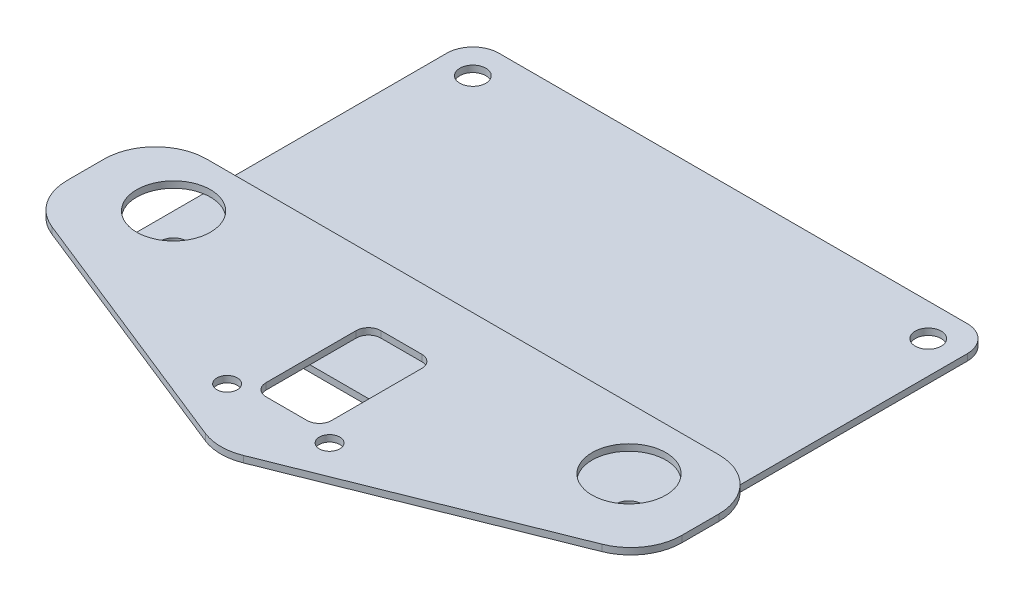
ISO-10303-21;
HEADER;
FILE_DESCRIPTION(('STEP AP214'),'2;1');
FILE_NAME('part.step','',(''),(''),'','','');
FILE_SCHEMA(('AUTOMOTIVE_DESIGN { 1 0 10303 214 1 1 1 1 }'));
ENDSEC;
DATA;
#1=APPLICATION_CONTEXT('core data for automotive mechanical design processes');
#2=APPLICATION_PROTOCOL_DEFINITION('international standard','automotive_design',2000,#1);
#3=PRODUCT_CONTEXT('',#1,'mechanical');
#4=PRODUCT('Part','Part','',(#3));
#5=PRODUCT_RELATED_PRODUCT_CATEGORY('part','',(#4));
#6=PRODUCT_DEFINITION_FORMATION('','',#4);
#7=PRODUCT_DEFINITION_CONTEXT('part definition',#1,'design');
#8=PRODUCT_DEFINITION('design','',#6,#7);
#9=PRODUCT_DEFINITION_SHAPE('','',#8);
#10=(LENGTH_UNIT() NAMED_UNIT(*) SI_UNIT(.MILLI.,.METRE.));
#11=(NAMED_UNIT(*) PLANE_ANGLE_UNIT() SI_UNIT($,.RADIAN.));
#12=(NAMED_UNIT(*) SI_UNIT($,.STERADIAN.) SOLID_ANGLE_UNIT());
#13=UNCERTAINTY_MEASURE_WITH_UNIT(LENGTH_MEASURE(1.E-05),#10,'distance_accuracy_value','');
#14=(GEOMETRIC_REPRESENTATION_CONTEXT(3) GLOBAL_UNCERTAINTY_ASSIGNED_CONTEXT((#13)) GLOBAL_UNIT_ASSIGNED_CONTEXT((#10,
#11,#12)) REPRESENTATION_CONTEXT('',''));
#15=CARTESIAN_POINT('',(0.,0.,0.));
#16=DIRECTION('',(0.,0.,1.));
#17=DIRECTION('',(1.,0.,0.));
#18=AXIS2_PLACEMENT_3D('',#15,#16,#17);
#19=CARTESIAN_POINT('',(0.,19.05,0.));
#20=DIRECTION('',(0.,-1.,0.));
#21=DIRECTION('',(0.,0.,-1.));
#22=AXIS2_PLACEMENT_3D('',#19,#20,#21);
#23=PLANE('',#22);
#24=DIRECTION('',(0.,0.,1.));
#25=VECTOR('',#24,1.);
#26=CARTESIAN_POINT('',(-16.,19.05,0.));
#27=LINE('',#26,#25);
#28=CARTESIAN_POINT('',(-16.,19.05,79.025));
#29=VERTEX_POINT('',#28);
#30=CARTESIAN_POINT('',(-16.,19.05,123.025));
#31=VERTEX_POINT('',#30);
#32=EDGE_CURVE('E415',#29,#31,#27,.T.);
#33=ORIENTED_EDGE('',*,*,#32,.F.);
#34=CARTESIAN_POINT('',(-10.,19.05,79.025));
#35=DIRECTION('',(0.,-1.,0.));
#36=DIRECTION('',(0.,0.,-1.));
#37=AXIS2_PLACEMENT_3D('',#34,#35,#36);
#38=CIRCLE('',#37,6.);
#39=CARTESIAN_POINT('',(-10.,19.05,73.025));
#40=VERTEX_POINT('',#39);
#41=EDGE_CURVE('E172',#29,#40,#38,.T.);
#42=ORIENTED_EDGE('',*,*,#41,.T.);
#43=DIRECTION('',(1.,0.,0.));
#44=VECTOR('',#43,1.);
#45=CARTESIAN_POINT('',(0.,19.05,73.025));
#46=LINE('',#45,#44);
#47=CARTESIAN_POINT('',(10.,19.05,73.025));
#48=VERTEX_POINT('',#47);
#49=EDGE_CURVE('E407',#40,#48,#46,.T.);
#50=ORIENTED_EDGE('',*,*,#49,.T.);
#51=CARTESIAN_POINT('',(10.,19.05,79.025));
#52=DIRECTION('',(0.,-1.,0.));
#53=DIRECTION('',(0.,0.,-1.));
#54=AXIS2_PLACEMENT_3D('',#51,#52,#53);
#55=CIRCLE('',#54,6.);
#56=CARTESIAN_POINT('',(16.,19.05,79.025));
#57=VERTEX_POINT('',#56);
#58=EDGE_CURVE('E13',#48,#57,#55,.T.);
#59=ORIENTED_EDGE('',*,*,#58,.T.);
#60=DIRECTION('',(0.,0.,1.));
#61=VECTOR('',#60,1.);
#62=CARTESIAN_POINT('',(16.,19.05,0.));
#63=LINE('',#62,#61);
#64=CARTESIAN_POINT('',(16.,19.05,123.025));
#65=VERTEX_POINT('',#64);
#66=EDGE_CURVE('E405',#57,#65,#63,.T.);
#67=ORIENTED_EDGE('',*,*,#66,.T.);
#68=CARTESIAN_POINT('',(10.,19.05,123.025));
#69=DIRECTION('',(0.,-1.,0.));
#70=DIRECTION('',(0.,0.,-1.));
#71=AXIS2_PLACEMENT_3D('',#68,#69,#70);
#72=CIRCLE('',#71,6.);
#73=CARTESIAN_POINT('',(10.,19.05,129.025));
#74=VERTEX_POINT('',#73);
#75=EDGE_CURVE('E378',#65,#74,#72,.T.);
#76=ORIENTED_EDGE('',*,*,#75,.T.);
#77=DIRECTION('',(1.,0.,0.));
#78=VECTOR('',#77,1.);
#79=CARTESIAN_POINT('',(0.,19.05,129.025));
#80=LINE('',#79,#78);
#81=CARTESIAN_POINT('',(-10.,19.05,129.025));
#82=VERTEX_POINT('',#81);
#83=EDGE_CURVE('E426',#82,#74,#80,.T.);
#84=ORIENTED_EDGE('',*,*,#83,.F.);
#85=CARTESIAN_POINT('',(-10.,19.05,123.025));
#86=DIRECTION('',(0.,-1.,0.));
#87=DIRECTION('',(0.,0.,-1.));
#88=AXIS2_PLACEMENT_3D('',#85,#86,#87);
#89=CIRCLE('',#88,6.);
#90=EDGE_CURVE('E384',#82,#31,#89,.T.);
#91=ORIENTED_EDGE('',*,*,#90,.T.);
#92=EDGE_LOOP('',(#33,#42,#50,#59,#67,#76,#84,#91));
#93=FACE_BOUND('',#92,.T.);
#94=DIRECTION('',(1.,0.,0.));
#95=VECTOR('',#94,1.);
#96=CARTESIAN_POINT('',(-150.,19.05,43.025));
#97=LINE('',#96,#95);
#98=CARTESIAN_POINT('',(-125.,19.05,43.025));
#99=VERTEX_POINT('',#98);
#100=CARTESIAN_POINT('',(125.,19.05,43.0249999999999));
#101=VERTEX_POINT('',#100);
#102=EDGE_CURVE('E443',#99,#101,#97,.T.);
#103=ORIENTED_EDGE('',*,*,#102,.F.);
#104=CARTESIAN_POINT('',(-125.,19.05,68.025));
#105=DIRECTION('',(0.,-1.,0.));
#106=DIRECTION('',(0.,0.,-1.));
#107=AXIS2_PLACEMENT_3D('',#104,#105,#106);
#108=CIRCLE('',#107,25.);
#109=CARTESIAN_POINT('',(-150.,19.05,68.025));
#110=VERTEX_POINT('',#109);
#111=EDGE_CURVE('E337',#99,#110,#108,.F.);
#112=ORIENTED_EDGE('',*,*,#111,.T.);
#113=DIRECTION('',(0.,0.,-1.));
#114=VECTOR('',#113,1.);
#115=CARTESIAN_POINT('',(-150.,19.05,103.025));
#116=LINE('',#115,#114);
#117=CARTESIAN_POINT('',(-150.,19.05,86.0991759643275));
#118=VERTEX_POINT('',#117);
#119=EDGE_CURVE('E441',#118,#110,#116,.T.);
#120=ORIENTED_EDGE('',*,*,#119,.F.);
#121=CARTESIAN_POINT('',(-125.,19.05,86.0991759643275));
#122=DIRECTION('',(0.,-1.,0.));
#123=DIRECTION('',(0.,0.,-1.));
#124=AXIS2_PLACEMENT_3D('',#121,#122,#123);
#125=CIRCLE('',#124,25.);
#126=CARTESIAN_POINT('',(-134.284766908853,19.05,109.311093236459));
#127=VERTEX_POINT('',#126);
#128=EDGE_CURVE('E309',#118,#127,#125,.F.);
#129=ORIENTED_EDGE('',*,*,#128,.T.);
#130=DIRECTION('',(-0.928476690885259,0.,-0.371390676354104));
#131=VECTOR('',#130,1.);
#132=CARTESIAN_POINT('',(0.,19.05,163.025));
#133=LINE('',#132,#131);
#134=CARTESIAN_POINT('',(-9.28476690885259,19.05,159.311093236459));
#135=VERTEX_POINT('',#134);
#136=EDGE_CURVE('E310',#135,#127,#133,.T.);
#137=ORIENTED_EDGE('',*,*,#136,.F.);
#138=CARTESIAN_POINT('',(0.,19.05,136.099175964327));
#139=DIRECTION('',(0.,-1.,0.));
#140=DIRECTION('',(0.,0.,-1.));
#141=AXIS2_PLACEMENT_3D('',#138,#139,#140);
#142=CIRCLE('',#141,25.);
#143=CARTESIAN_POINT('',(9.2847669088526,19.05,159.311093236459));
#144=VERTEX_POINT('',#143);
#145=EDGE_CURVE('E330',#135,#144,#142,.F.);
#146=ORIENTED_EDGE('',*,*,#145,.T.);
#147=DIRECTION('',(-0.928476690885259,0.,0.371390676354104));
#148=VECTOR('',#147,1.);
#149=CARTESIAN_POINT('',(150.,19.05,103.025));
#150=LINE('',#149,#148);
#151=CARTESIAN_POINT('',(134.284766908853,19.05,109.311093236459));
#152=VERTEX_POINT('',#151);
#153=EDGE_CURVE('E315',#152,#144,#150,.T.);
#154=ORIENTED_EDGE('',*,*,#153,.F.);
#155=CARTESIAN_POINT('',(125.,19.05,86.0991759643275));
#156=DIRECTION('',(0.,-1.,0.));
#157=DIRECTION('',(0.,0.,-1.));
#158=AXIS2_PLACEMENT_3D('',#155,#156,#157);
#159=CIRCLE('',#158,25.);
#160=CARTESIAN_POINT('',(150.,19.05,86.0991759643275));
#161=VERTEX_POINT('',#160);
#162=EDGE_CURVE('E332',#152,#161,#159,.F.);
#163=ORIENTED_EDGE('',*,*,#162,.T.);
#164=DIRECTION('',(0.,0.,1.));
#165=VECTOR('',#164,1.);
#166=CARTESIAN_POINT('',(150.,19.05,43.0249999999999));
#167=LINE('',#166,#165);
#168=CARTESIAN_POINT('',(150.,19.05,68.0249999999999));
#169=VERTEX_POINT('',#168);
#170=EDGE_CURVE('E446',#169,#161,#167,.T.);
#171=ORIENTED_EDGE('',*,*,#170,.F.);
#172=CARTESIAN_POINT('',(125.,19.05,68.0249999999999));
#173=DIRECTION('',(0.,-1.,0.));
#174=DIRECTION('',(0.,0.,-1.));
#175=AXIS2_PLACEMENT_3D('',#172,#173,#174);
#176=CIRCLE('',#175,25.);
#177=EDGE_CURVE('E334',#169,#101,#176,.F.);
#178=ORIENTED_EDGE('',*,*,#177,.T.);
#179=EDGE_LOOP('',(#103,#112,#120,#129,#137,#146,#154,#163,#171,#178));
#180=FACE_BOUND('',#179,.T.);
#181=CARTESIAN_POINT('',(111.125,19.05,73.025));
#182=DIRECTION('',(0.,1.,0.));
#183=DIRECTION('',(0.,0.,1.));
#184=AXIS2_PLACEMENT_3D('',#181,#182,#183);
#185=CIRCLE('',#184,18.);
#186=CARTESIAN_POINT('',(111.125,19.05,91.025));
#187=VERTEX_POINT('',#186);
#188=EDGE_CURVE('E305',#187,#187,#185,.T.);
#189=ORIENTED_EDGE('',*,*,#188,.F.);
#190=EDGE_LOOP('',(#189));
#191=FACE_BOUND('',#190,.T.);
#192=CARTESIAN_POINT('',(-111.125,19.05,73.025));
#193=DIRECTION('',(0.,1.,0.));
#194=DIRECTION('',(0.,0.,1.));
#195=AXIS2_PLACEMENT_3D('',#192,#193,#194);
#196=CIRCLE('',#195,18.);
#197=CARTESIAN_POINT('',(-111.125,19.05,91.025));
#198=VERTEX_POINT('',#197);
#199=EDGE_CURVE('E432',#198,#198,#196,.T.);
#200=ORIENTED_EDGE('',*,*,#199,.F.);
#201=EDGE_LOOP('',(#200));
#202=FACE_BOUND('',#201,.T.);
#203=CARTESIAN_POINT('',(-25.,19.05,133.025));
#204=DIRECTION('',(0.,1.,0.));
#205=DIRECTION('',(0.,0.,1.));
#206=AXIS2_PLACEMENT_3D('',#203,#204,#205);
#207=CIRCLE('',#206,5.);
#208=CARTESIAN_POINT('',(-25.,19.05,138.025));
#209=VERTEX_POINT('',#208);
#210=EDGE_CURVE('E716',#209,#209,#207,.T.);
#211=ORIENTED_EDGE('',*,*,#210,.F.);
#212=EDGE_LOOP('',(#211));
#213=FACE_BOUND('',#212,.T.);
#214=CARTESIAN_POINT('',(25.,19.05,133.025));
#215=DIRECTION('',(0.,1.,0.));
#216=DIRECTION('',(0.,0.,1.));
#217=AXIS2_PLACEMENT_3D('',#214,#215,#216);
#218=CIRCLE('',#217,5.);
#219=CARTESIAN_POINT('',(25.,19.05,138.025));
#220=VERTEX_POINT('',#219);
#221=EDGE_CURVE('E719',#220,#220,#218,.T.);
#222=ORIENTED_EDGE('',*,*,#221,.F.);
#223=EDGE_LOOP('',(#222));
#224=FACE_BOUND('',#223,.T.);
#225=ADVANCED_FACE('F150',(#93,#180,#191,#202,#213,#224),#23,.F.);
#226=CARTESIAN_POINT('',(0.,15.875,0.));
#227=DIRECTION('',(0.,-1.,0.));
#228=DIRECTION('',(0.,0.,-1.));
#229=AXIS2_PLACEMENT_3D('',#226,#227,#228);
#230=PLANE('',#229);
#231=CARTESIAN_POINT('',(-25.,15.875,133.025));
#232=DIRECTION('',(0.,1.,0.));
#233=DIRECTION('',(0.,0.,1.));
#234=AXIS2_PLACEMENT_3D('',#231,#232,#233);
#235=CIRCLE('',#234,5.);
#236=CARTESIAN_POINT('',(-25.,15.875,138.025));
#237=VERTEX_POINT('',#236);
#238=EDGE_CURVE('E720',#237,#237,#235,.T.);
#239=ORIENTED_EDGE('',*,*,#238,.T.);
#240=EDGE_LOOP('',(#239));
#241=FACE_BOUND('',#240,.T.);
#242=CARTESIAN_POINT('',(111.125,15.875,73.025));
#243=DIRECTION('',(0.,1.,0.));
#244=DIRECTION('',(0.,0.,1.));
#245=AXIS2_PLACEMENT_3D('',#242,#243,#244);
#246=CIRCLE('',#245,18.);
#247=CARTESIAN_POINT('',(111.125,15.875,91.025));
#248=VERTEX_POINT('',#247);
#249=EDGE_CURVE('E430',#248,#248,#246,.T.);
#250=ORIENTED_EDGE('',*,*,#249,.T.);
#251=EDGE_LOOP('',(#250));
#252=FACE_BOUND('',#251,.T.);
#253=DIRECTION('',(0.,0.,-1.));
#254=VECTOR('',#253,1.);
#255=CARTESIAN_POINT('',(-150.,15.875,103.025));
#256=LINE('',#255,#254);
#257=CARTESIAN_POINT('',(-150.,15.875,86.0991759643275));
#258=VERTEX_POINT('',#257);
#259=CARTESIAN_POINT('',(-150.,15.875,68.025));
#260=VERTEX_POINT('',#259);
#261=EDGE_CURVE('E286',#258,#260,#256,.T.);
#262=ORIENTED_EDGE('',*,*,#261,.T.);
#263=CARTESIAN_POINT('',(-125.,15.875,68.025));
#264=DIRECTION('',(0.,-1.,0.));
#265=DIRECTION('',(0.,0.,-1.));
#266=AXIS2_PLACEMENT_3D('',#263,#264,#265);
#267=CIRCLE('',#266,25.);
#268=CARTESIAN_POINT('',(-125.,15.875,43.025));
#269=VERTEX_POINT('',#268);
#270=EDGE_CURVE('E293',#260,#269,#267,.T.);
#271=ORIENTED_EDGE('',*,*,#270,.T.);
#272=DIRECTION('',(1.,0.,0.));
#273=VECTOR('',#272,1.);
#274=CARTESIAN_POINT('',(-150.,15.875,43.025));
#275=LINE('',#274,#273);
#276=CARTESIAN_POINT('',(125.,15.875,43.0249999999999));
#277=VERTEX_POINT('',#276);
#278=EDGE_CURVE('E304',#269,#277,#275,.T.);
#279=ORIENTED_EDGE('',*,*,#278,.T.);
#280=CARTESIAN_POINT('',(125.,15.875,68.0249999999999));
#281=DIRECTION('',(0.,-1.,0.));
#282=DIRECTION('',(0.,0.,-1.));
#283=AXIS2_PLACEMENT_3D('',#280,#281,#282);
#284=CIRCLE('',#283,25.);
#285=CARTESIAN_POINT('',(150.,15.875,68.0249999999999));
#286=VERTEX_POINT('',#285);
#287=EDGE_CURVE('E294',#277,#286,#284,.T.);
#288=ORIENTED_EDGE('',*,*,#287,.T.);
#289=DIRECTION('',(0.,0.,1.));
#290=VECTOR('',#289,1.);
#291=CARTESIAN_POINT('',(150.,15.875,43.0249999999999));
#292=LINE('',#291,#290);
#293=CARTESIAN_POINT('',(150.,15.875,86.0991759643275));
#294=VERTEX_POINT('',#293);
#295=EDGE_CURVE('E453',#286,#294,#292,.T.);
#296=ORIENTED_EDGE('',*,*,#295,.T.);
#297=CARTESIAN_POINT('',(125.,15.875,86.0991759643275));
#298=DIRECTION('',(0.,-1.,0.));
#299=DIRECTION('',(0.,0.,-1.));
#300=AXIS2_PLACEMENT_3D('',#297,#298,#299);
#301=CIRCLE('',#300,25.);
#302=CARTESIAN_POINT('',(134.284766908853,15.875,109.311093236459));
#303=VERTEX_POINT('',#302);
#304=EDGE_CURVE('E321',#294,#303,#301,.T.);
#305=ORIENTED_EDGE('',*,*,#304,.T.);
#306=DIRECTION('',(-0.928476690885259,0.,0.371390676354104));
#307=VECTOR('',#306,1.);
#308=CARTESIAN_POINT('',(150.,15.875,103.025));
#309=LINE('',#308,#307);
#310=CARTESIAN_POINT('',(9.2847669088526,15.875,159.311093236459));
#311=VERTEX_POINT('',#310);
#312=EDGE_CURVE('E455',#303,#311,#309,.T.);
#313=ORIENTED_EDGE('',*,*,#312,.T.);
#314=CARTESIAN_POINT('',(0.,15.875,136.099175964327));
#315=DIRECTION('',(0.,-1.,0.));
#316=DIRECTION('',(0.,0.,-1.));
#317=AXIS2_PLACEMENT_3D('',#314,#315,#316);
#318=CIRCLE('',#317,25.);
#319=CARTESIAN_POINT('',(-9.28476690885259,15.875,159.311093236459));
#320=VERTEX_POINT('',#319);
#321=EDGE_CURVE('E312',#311,#320,#318,.T.);
#322=ORIENTED_EDGE('',*,*,#321,.T.);
#323=DIRECTION('',(-0.928476690885259,0.,-0.371390676354104));
#324=VECTOR('',#323,1.);
#325=CARTESIAN_POINT('',(0.,15.875,163.025));
#326=LINE('',#325,#324);
#327=CARTESIAN_POINT('',(-134.284766908853,15.875,109.311093236459));
#328=VERTEX_POINT('',#327);
#329=EDGE_CURVE('E288',#320,#328,#326,.T.);
#330=ORIENTED_EDGE('',*,*,#329,.T.);
#331=CARTESIAN_POINT('',(-125.,15.875,86.0991759643275));
#332=DIRECTION('',(0.,-1.,0.));
#333=DIRECTION('',(0.,0.,-1.));
#334=AXIS2_PLACEMENT_3D('',#331,#332,#333);
#335=CIRCLE('',#334,25.);
#336=EDGE_CURVE('E282',#328,#258,#335,.T.);
#337=ORIENTED_EDGE('',*,*,#336,.T.);
#338=EDGE_LOOP('',(#262,#271,#279,#288,#296,#305,#313,#322,#330,#337));
#339=FACE_BOUND('',#338,.T.);
#340=DIRECTION('',(0.,0.,1.));
#341=VECTOR('',#340,1.);
#342=CARTESIAN_POINT('',(16.,15.875,0.));
#343=LINE('',#342,#341);
#344=CARTESIAN_POINT('',(16.,15.875,79.025));
#345=VERTEX_POINT('',#344);
#346=CARTESIAN_POINT('',(16.,15.875,123.025));
#347=VERTEX_POINT('',#346);
#348=EDGE_CURVE('E394',#345,#347,#343,.T.);
#349=ORIENTED_EDGE('',*,*,#348,.F.);
#350=CARTESIAN_POINT('',(10.,15.875,79.025));
#351=DIRECTION('',(0.,-1.,0.));
#352=DIRECTION('',(0.,0.,-1.));
#353=AXIS2_PLACEMENT_3D('',#350,#351,#352);
#354=CIRCLE('',#353,6.);
#355=CARTESIAN_POINT('',(10.,15.875,73.025));
#356=VERTEX_POINT('',#355);
#357=EDGE_CURVE('E158',#345,#356,#354,.F.);
#358=ORIENTED_EDGE('',*,*,#357,.T.);
#359=DIRECTION('',(1.,0.,0.));
#360=VECTOR('',#359,1.);
#361=CARTESIAN_POINT('',(0.,15.875,73.025));
#362=LINE('',#361,#360);
#363=CARTESIAN_POINT('',(-10.,15.875,73.025));
#364=VERTEX_POINT('',#363);
#365=EDGE_CURVE('E392',#364,#356,#362,.T.);
#366=ORIENTED_EDGE('',*,*,#365,.F.);
#367=CARTESIAN_POINT('',(-10.,15.875,79.025));
#368=DIRECTION('',(0.,-1.,0.));
#369=DIRECTION('',(0.,0.,-1.));
#370=AXIS2_PLACEMENT_3D('',#367,#368,#369);
#371=CIRCLE('',#370,6.);
#372=CARTESIAN_POINT('',(-16.,15.875,79.025));
#373=VERTEX_POINT('',#372);
#374=EDGE_CURVE('E387',#364,#373,#371,.F.);
#375=ORIENTED_EDGE('',*,*,#374,.T.);
#376=DIRECTION('',(0.,0.,1.));
#377=VECTOR('',#376,1.);
#378=CARTESIAN_POINT('',(-16.,15.875,0.));
#379=LINE('',#378,#377);
#380=CARTESIAN_POINT('',(-16.,15.875,123.025));
#381=VERTEX_POINT('',#380);
#382=EDGE_CURVE('E399',#373,#381,#379,.T.);
#383=ORIENTED_EDGE('',*,*,#382,.T.);
#384=CARTESIAN_POINT('',(-10.,15.875,123.025));
#385=DIRECTION('',(0.,-1.,0.));
#386=DIRECTION('',(0.,0.,-1.));
#387=AXIS2_PLACEMENT_3D('',#384,#385,#386);
#388=CIRCLE('',#387,6.);
#389=CARTESIAN_POINT('',(-10.,15.875,129.025));
#390=VERTEX_POINT('',#389);
#391=EDGE_CURVE('E381',#381,#390,#388,.F.);
#392=ORIENTED_EDGE('',*,*,#391,.T.);
#393=DIRECTION('',(1.,0.,0.));
#394=VECTOR('',#393,1.);
#395=CARTESIAN_POINT('',(0.,15.875,129.025));
#396=LINE('',#395,#394);
#397=CARTESIAN_POINT('',(10.,15.875,129.025));
#398=VERTEX_POINT('',#397);
#399=EDGE_CURVE('E412',#390,#398,#396,.T.);
#400=ORIENTED_EDGE('',*,*,#399,.T.);
#401=CARTESIAN_POINT('',(10.,15.875,123.025));
#402=DIRECTION('',(0.,-1.,0.));
#403=DIRECTION('',(0.,0.,-1.));
#404=AXIS2_PLACEMENT_3D('',#401,#402,#403);
#405=CIRCLE('',#404,6.);
#406=EDGE_CURVE('E375',#398,#347,#405,.F.);
#407=ORIENTED_EDGE('',*,*,#406,.T.);
#408=EDGE_LOOP('',(#349,#358,#366,#375,#383,#392,#400,#407));
#409=FACE_BOUND('',#408,.T.);
#410=CARTESIAN_POINT('',(-111.125,15.875,73.025));
#411=DIRECTION('',(0.,1.,0.));
#412=DIRECTION('',(0.,0.,1.));
#413=AXIS2_PLACEMENT_3D('',#410,#411,#412);
#414=CIRCLE('',#413,18.);
#415=CARTESIAN_POINT('',(-111.125,15.875,91.025));
#416=VERTEX_POINT('',#415);
#417=EDGE_CURVE('E420',#416,#416,#414,.T.);
#418=ORIENTED_EDGE('',*,*,#417,.T.);
#419=EDGE_LOOP('',(#418));
#420=FACE_BOUND('',#419,.T.);
#421=CARTESIAN_POINT('',(25.,15.875,133.025));
#422=DIRECTION('',(0.,1.,0.));
#423=DIRECTION('',(0.,0.,1.));
#424=AXIS2_PLACEMENT_3D('',#421,#422,#423);
#425=CIRCLE('',#424,5.);
#426=CARTESIAN_POINT('',(25.,15.875,138.025));
#427=VERTEX_POINT('',#426);
#428=EDGE_CURVE('E721',#427,#427,#425,.T.);
#429=ORIENTED_EDGE('',*,*,#428,.T.);
#430=EDGE_LOOP('',(#429));
#431=FACE_BOUND('',#430,.T.);
#432=ADVANCED_FACE('F284',(#241,#252,#339,#409,#420,#431),#230,.T.);
#433=CARTESIAN_POINT('',(-150.,19.05,103.025));
#434=DIRECTION('',(-1.,0.,0.));
#435=DIRECTION('',(0.,0.,1.));
#436=AXIS2_PLACEMENT_3D('',#433,#434,#435);
#437=PLANE('',#436);
#438=ORIENTED_EDGE('',*,*,#119,.T.);
#439=DIRECTION('',(0.,-1.,0.));
#440=VECTOR('',#439,1.);
#441=CARTESIAN_POINT('',(-150.,19.05,68.025));
#442=LINE('',#441,#440);
#443=EDGE_CURVE('E303',#110,#260,#442,.T.);
#444=ORIENTED_EDGE('',*,*,#443,.T.);
#445=ORIENTED_EDGE('',*,*,#261,.F.);
#446=DIRECTION('',(0.,-1.,0.));
#447=VECTOR('',#446,1.);
#448=CARTESIAN_POINT('',(-150.,19.05,86.0991759643275));
#449=LINE('',#448,#447);
#450=EDGE_CURVE('E300',#258,#118,#449,.F.);
#451=ORIENTED_EDGE('',*,*,#450,.T.);
#452=EDGE_LOOP('',(#438,#444,#445,#451));
#453=FACE_BOUND('',#452,.T.);
#454=ADVANCED_FACE('F299',(#453),#437,.T.);
#455=CARTESIAN_POINT('',(0.,19.05,163.025));
#456=DIRECTION('',(-0.371390676354104,0.,0.928476690885259));
#457=DIRECTION('',(0.928476690885259,0.,0.371390676354104));
#458=AXIS2_PLACEMENT_3D('',#455,#456,#457);
#459=PLANE('',#458);
#460=ORIENTED_EDGE('',*,*,#136,.T.);
#461=DIRECTION('',(0.,-1.,0.));
#462=VECTOR('',#461,1.);
#463=CARTESIAN_POINT('',(-134.284766908853,19.05,109.311093236459));
#464=LINE('',#463,#462);
#465=EDGE_CURVE('E341',#127,#328,#464,.T.);
#466=ORIENTED_EDGE('',*,*,#465,.T.);
#467=ORIENTED_EDGE('',*,*,#329,.F.);
#468=DIRECTION('',(0.,-1.,0.));
#469=VECTOR('',#468,1.);
#470=CARTESIAN_POINT('',(-9.28476690885259,19.05,159.311093236459));
#471=LINE('',#470,#469);
#472=EDGE_CURVE('E339',#320,#135,#471,.F.);
#473=ORIENTED_EDGE('',*,*,#472,.T.);
#474=EDGE_LOOP('',(#460,#466,#467,#473));
#475=FACE_BOUND('',#474,.T.);
#476=ADVANCED_FACE('F488',(#475),#459,.T.);
#477=CARTESIAN_POINT('',(150.,19.05,103.025));
#478=DIRECTION('',(0.371390676354104,0.,0.928476690885259));
#479=DIRECTION('',(0.928476690885259,0.,-0.371390676354104));
#480=AXIS2_PLACEMENT_3D('',#477,#478,#479);
#481=PLANE('',#480);
#482=ORIENTED_EDGE('',*,*,#312,.F.);
#483=DIRECTION('',(0.,-1.,0.));
#484=VECTOR('',#483,1.);
#485=CARTESIAN_POINT('',(134.284766908853,19.05,109.311093236459));
#486=LINE('',#485,#484);
#487=EDGE_CURVE('E351',#303,#152,#486,.F.);
#488=ORIENTED_EDGE('',*,*,#487,.T.);
#489=ORIENTED_EDGE('',*,*,#153,.T.);
#490=DIRECTION('',(0.,-1.,0.));
#491=VECTOR('',#490,1.);
#492=CARTESIAN_POINT('',(9.2847669088526,19.05,159.311093236459));
#493=LINE('',#492,#491);
#494=EDGE_CURVE('E348',#144,#311,#493,.T.);
#495=ORIENTED_EDGE('',*,*,#494,.T.);
#496=EDGE_LOOP('',(#482,#488,#489,#495));
#497=FACE_BOUND('',#496,.T.);
#498=ADVANCED_FACE('F460',(#497),#481,.T.);
#499=CARTESIAN_POINT('',(150.,19.05,43.0249999999999));
#500=DIRECTION('',(1.,0.,0.));
#501=DIRECTION('',(0.,0.,-1.));
#502=AXIS2_PLACEMENT_3D('',#499,#500,#501);
#503=PLANE('',#502);
#504=ORIENTED_EDGE('',*,*,#295,.F.);
#505=DIRECTION('',(0.,-1.,0.));
#506=VECTOR('',#505,1.);
#507=CARTESIAN_POINT('',(150.,19.05,68.0249999999999));
#508=LINE('',#507,#506);
#509=EDGE_CURVE('E346',#286,#169,#508,.F.);
#510=ORIENTED_EDGE('',*,*,#509,.T.);
#511=ORIENTED_EDGE('',*,*,#170,.T.);
#512=DIRECTION('',(0.,-1.,0.));
#513=VECTOR('',#512,1.);
#514=CARTESIAN_POINT('',(150.,19.05,86.0991759643275));
#515=LINE('',#514,#513);
#516=EDGE_CURVE('E343',#161,#294,#515,.T.);
#517=ORIENTED_EDGE('',*,*,#516,.T.);
#518=EDGE_LOOP('',(#504,#510,#511,#517));
#519=FACE_BOUND('',#518,.T.);
#520=ADVANCED_FACE('F473',(#519),#503,.T.);
#521=CARTESIAN_POINT('',(-150.,19.05,43.025));
#522=DIRECTION('',(0.,0.,-1.));
#523=DIRECTION('',(-1.,0.,0.));
#524=AXIS2_PLACEMENT_3D('',#521,#522,#523);
#525=PLANE('',#524);
#526=ORIENTED_EDGE('',*,*,#278,.F.);
#527=DIRECTION('',(0.,-1.,0.));
#528=VECTOR('',#527,1.);
#529=CARTESIAN_POINT('',(-125.,19.05,43.025));
#530=LINE('',#529,#528);
#531=EDGE_CURVE('E328',#269,#99,#530,.F.);
#532=ORIENTED_EDGE('',*,*,#531,.T.);
#533=ORIENTED_EDGE('',*,*,#102,.T.);
#534=DIRECTION('',(0.,-1.,0.));
#535=VECTOR('',#534,1.);
#536=CARTESIAN_POINT('',(125.,19.05,43.0249999999999));
#537=LINE('',#536,#535);
#538=EDGE_CURVE('E325',#101,#277,#537,.T.);
#539=ORIENTED_EDGE('',*,*,#538,.T.);
#540=EDGE_LOOP('',(#526,#532,#533,#539));
#541=FACE_BOUND('',#540,.T.);
#542=ADVANCED_FACE('F481',(#541),#525,.T.);
#543=CARTESIAN_POINT('',(111.125,19.05,73.025));
#544=DIRECTION('',(0.,-1.,0.));
#545=DIRECTION('',(0.,0.,-1.));
#546=AXIS2_PLACEMENT_3D('',#543,#544,#545);
#547=CYLINDRICAL_SURFACE('',#546,18.);
#548=ORIENTED_EDGE('',*,*,#188,.T.);
#549=EDGE_LOOP('',(#548));
#550=FACE_BOUND('',#549,.T.);
#551=ORIENTED_EDGE('',*,*,#249,.F.);
#552=EDGE_LOOP('',(#551));
#553=FACE_BOUND('',#552,.T.);
#554=ADVANCED_FACE('F511',(#550,#553),#547,.F.);
#555=CARTESIAN_POINT('',(16.,19.05,0.));
#556=DIRECTION('',(1.,0.,0.));
#557=DIRECTION('',(0.,0.,-1.));
#558=AXIS2_PLACEMENT_3D('',#555,#556,#557);
#559=PLANE('',#558);
#560=ORIENTED_EDGE('',*,*,#348,.T.);
#561=DIRECTION('',(0.,-1.,0.));
#562=VECTOR('',#561,1.);
#563=CARTESIAN_POINT('',(16.,19.05,123.025));
#564=LINE('',#563,#562);
#565=EDGE_CURVE('E362',#347,#65,#564,.F.);
#566=ORIENTED_EDGE('',*,*,#565,.T.);
#567=ORIENTED_EDGE('',*,*,#66,.F.);
#568=DIRECTION('',(0.,-1.,0.));
#569=VECTOR('',#568,1.);
#570=CARTESIAN_POINT('',(16.,15.875,79.025));
#571=LINE('',#570,#569);
#572=EDGE_CURVE('E359',#57,#345,#571,.T.);
#573=ORIENTED_EDGE('',*,*,#572,.T.);
#574=EDGE_LOOP('',(#560,#566,#567,#573));
#575=FACE_BOUND('',#574,.T.);
#576=ADVANCED_FACE('F409',(#575),#559,.F.);
#577=CARTESIAN_POINT('',(0.,19.05,73.025));
#578=DIRECTION('',(0.,0.,-1.));
#579=DIRECTION('',(-1.,0.,0.));
#580=AXIS2_PLACEMENT_3D('',#577,#578,#579);
#581=PLANE('',#580);
#582=ORIENTED_EDGE('',*,*,#49,.F.);
#583=DIRECTION('',(0.,-1.,0.));
#584=VECTOR('',#583,1.);
#585=CARTESIAN_POINT('',(-10.,19.05,73.025));
#586=LINE('',#585,#584);
#587=EDGE_CURVE('E372',#40,#364,#586,.T.);
#588=ORIENTED_EDGE('',*,*,#587,.T.);
#589=ORIENTED_EDGE('',*,*,#365,.T.);
#590=DIRECTION('',(0.,-1.,0.));
#591=VECTOR('',#590,1.);
#592=CARTESIAN_POINT('',(10.,19.05,73.025));
#593=LINE('',#592,#591);
#594=EDGE_CURVE('E165',#356,#48,#593,.F.);
#595=ORIENTED_EDGE('',*,*,#594,.T.);
#596=EDGE_LOOP('',(#582,#588,#589,#595));
#597=FACE_BOUND('',#596,.T.);
#598=ADVANCED_FACE('F397',(#597),#581,.F.);
#599=CARTESIAN_POINT('',(-16.,19.05,0.));
#600=DIRECTION('',(1.,0.,0.));
#601=DIRECTION('',(0.,0.,-1.));
#602=AXIS2_PLACEMENT_3D('',#599,#600,#601);
#603=PLANE('',#602);
#604=ORIENTED_EDGE('',*,*,#32,.T.);
#605=DIRECTION('',(0.,-1.,0.));
#606=VECTOR('',#605,1.);
#607=CARTESIAN_POINT('',(-16.,15.875,123.025));
#608=LINE('',#607,#606);
#609=EDGE_CURVE('E367',#31,#381,#608,.T.);
#610=ORIENTED_EDGE('',*,*,#609,.T.);
#611=ORIENTED_EDGE('',*,*,#382,.F.);
#612=DIRECTION('',(0.,-1.,0.));
#613=VECTOR('',#612,1.);
#614=CARTESIAN_POINT('',(-16.,19.05,79.025));
#615=LINE('',#614,#613);
#616=EDGE_CURVE('E365',#373,#29,#615,.F.);
#617=ORIENTED_EDGE('',*,*,#616,.T.);
#618=EDGE_LOOP('',(#604,#610,#611,#617));
#619=FACE_BOUND('',#618,.T.);
#620=ADVANCED_FACE('F574',(#619),#603,.T.);
#621=CARTESIAN_POINT('',(0.,19.05,129.025));
#622=DIRECTION('',(0.,0.,-1.));
#623=DIRECTION('',(-1.,0.,0.));
#624=AXIS2_PLACEMENT_3D('',#621,#622,#623);
#625=PLANE('',#624);
#626=ORIENTED_EDGE('',*,*,#83,.T.);
#627=DIRECTION('',(0.,-1.,0.));
#628=VECTOR('',#627,1.);
#629=CARTESIAN_POINT('',(10.,19.05,129.025));
#630=LINE('',#629,#628);
#631=EDGE_CURVE('E355',#74,#398,#630,.T.);
#632=ORIENTED_EDGE('',*,*,#631,.T.);
#633=ORIENTED_EDGE('',*,*,#399,.F.);
#634=DIRECTION('',(0.,-1.,0.));
#635=VECTOR('',#634,1.);
#636=CARTESIAN_POINT('',(-10.,19.05,129.025));
#637=LINE('',#636,#635);
#638=EDGE_CURVE('E353',#390,#82,#637,.F.);
#639=ORIENTED_EDGE('',*,*,#638,.T.);
#640=EDGE_LOOP('',(#626,#632,#633,#639));
#641=FACE_BOUND('',#640,.T.);
#642=ADVANCED_FACE('F583',(#641),#625,.T.);
#643=CARTESIAN_POINT('',(-111.125,19.05,73.025));
#644=DIRECTION('',(0.,-1.,0.));
#645=DIRECTION('',(0.,0.,-1.));
#646=AXIS2_PLACEMENT_3D('',#643,#644,#645);
#647=CYLINDRICAL_SURFACE('',#646,18.);
#648=ORIENTED_EDGE('',*,*,#199,.T.);
#649=EDGE_LOOP('',(#648));
#650=FACE_BOUND('',#649,.T.);
#651=ORIENTED_EDGE('',*,*,#417,.F.);
#652=EDGE_LOOP('',(#651));
#653=FACE_BOUND('',#652,.T.);
#654=ADVANCED_FACE('F593',(#650,#653),#647,.F.);
#655=CARTESIAN_POINT('',(-25.,19.05,133.025));
#656=DIRECTION('',(0.,-1.,0.));
#657=DIRECTION('',(0.,0.,-1.));
#658=AXIS2_PLACEMENT_3D('',#655,#656,#657);
#659=CYLINDRICAL_SURFACE('',#658,5.);
#660=ORIENTED_EDGE('',*,*,#210,.T.);
#661=EDGE_LOOP('',(#660));
#662=FACE_BOUND('',#661,.T.);
#663=ORIENTED_EDGE('',*,*,#238,.F.);
#664=EDGE_LOOP('',(#663));
#665=FACE_BOUND('',#664,.T.);
#666=ADVANCED_FACE('F641',(#662,#665),#659,.F.);
#667=CARTESIAN_POINT('',(25.,19.05,133.025));
#668=DIRECTION('',(0.,-1.,0.));
#669=DIRECTION('',(0.,0.,-1.));
#670=AXIS2_PLACEMENT_3D('',#667,#668,#669);
#671=CYLINDRICAL_SURFACE('',#670,5.);
#672=ORIENTED_EDGE('',*,*,#221,.T.);
#673=EDGE_LOOP('',(#672));
#674=FACE_BOUND('',#673,.T.);
#675=ORIENTED_EDGE('',*,*,#428,.F.);
#676=EDGE_LOOP('',(#675));
#677=FACE_BOUND('',#676,.T.);
#678=ADVANCED_FACE('F526',(#674,#677),#671,.F.);
#679=CARTESIAN_POINT('',(-125.,19.05,68.025));
#680=DIRECTION('',(0.,-1.,0.));
#681=DIRECTION('',(0.,0.,-1.));
#682=AXIS2_PLACEMENT_3D('',#679,#680,#681);
#683=CYLINDRICAL_SURFACE('',#682,25.);
#684=ORIENTED_EDGE('',*,*,#111,.F.);
#685=ORIENTED_EDGE('',*,*,#531,.F.);
#686=ORIENTED_EDGE('',*,*,#270,.F.);
#687=ORIENTED_EDGE('',*,*,#443,.F.);
#688=EDGE_LOOP('',(#684,#685,#686,#687));
#689=FACE_BOUND('',#688,.T.);
#690=ADVANCED_FACE('F484',(#689),#683,.T.);
#691=CARTESIAN_POINT('',(-125.,19.05,86.0991759643275));
#692=DIRECTION('',(0.,-1.,0.));
#693=DIRECTION('',(0.,0.,-1.));
#694=AXIS2_PLACEMENT_3D('',#691,#692,#693);
#695=CYLINDRICAL_SURFACE('',#694,25.);
#696=ORIENTED_EDGE('',*,*,#128,.F.);
#697=ORIENTED_EDGE('',*,*,#450,.F.);
#698=ORIENTED_EDGE('',*,*,#336,.F.);
#699=ORIENTED_EDGE('',*,*,#465,.F.);
#700=EDGE_LOOP('',(#696,#697,#698,#699));
#701=FACE_BOUND('',#700,.T.);
#702=ADVANCED_FACE('F308',(#701),#695,.T.);
#703=CARTESIAN_POINT('',(125.,19.05,68.0249999999999));
#704=DIRECTION('',(0.,-1.,0.));
#705=DIRECTION('',(0.,0.,-1.));
#706=AXIS2_PLACEMENT_3D('',#703,#704,#705);
#707=CYLINDRICAL_SURFACE('',#706,25.);
#708=ORIENTED_EDGE('',*,*,#177,.F.);
#709=ORIENTED_EDGE('',*,*,#509,.F.);
#710=ORIENTED_EDGE('',*,*,#287,.F.);
#711=ORIENTED_EDGE('',*,*,#538,.F.);
#712=EDGE_LOOP('',(#708,#709,#710,#711));
#713=FACE_BOUND('',#712,.T.);
#714=ADVANCED_FACE('F476',(#713),#707,.T.);
#715=CARTESIAN_POINT('',(125.,19.05,86.0991759643275));
#716=DIRECTION('',(0.,-1.,0.));
#717=DIRECTION('',(0.,0.,-1.));
#718=AXIS2_PLACEMENT_3D('',#715,#716,#717);
#719=CYLINDRICAL_SURFACE('',#718,25.);
#720=ORIENTED_EDGE('',*,*,#162,.F.);
#721=ORIENTED_EDGE('',*,*,#487,.F.);
#722=ORIENTED_EDGE('',*,*,#304,.F.);
#723=ORIENTED_EDGE('',*,*,#516,.F.);
#724=EDGE_LOOP('',(#720,#721,#722,#723));
#725=FACE_BOUND('',#724,.T.);
#726=ADVANCED_FACE('F465',(#725),#719,.T.);
#727=CARTESIAN_POINT('',(0.,19.05,136.099175964327));
#728=DIRECTION('',(0.,-1.,0.));
#729=DIRECTION('',(0.,0.,-1.));
#730=AXIS2_PLACEMENT_3D('',#727,#728,#729);
#731=CYLINDRICAL_SURFACE('',#730,25.);
#732=ORIENTED_EDGE('',*,*,#145,.F.);
#733=ORIENTED_EDGE('',*,*,#472,.F.);
#734=ORIENTED_EDGE('',*,*,#321,.F.);
#735=ORIENTED_EDGE('',*,*,#494,.F.);
#736=EDGE_LOOP('',(#732,#733,#734,#735));
#737=FACE_BOUND('',#736,.T.);
#738=ADVANCED_FACE('F491',(#737),#731,.T.);
#739=CARTESIAN_POINT('',(10.,19.05,123.025));
#740=DIRECTION('',(0.,-1.,0.));
#741=DIRECTION('',(0.,0.,-1.));
#742=AXIS2_PLACEMENT_3D('',#739,#740,#741);
#743=CYLINDRICAL_SURFACE('',#742,6.);
#744=ORIENTED_EDGE('',*,*,#75,.F.);
#745=ORIENTED_EDGE('',*,*,#565,.F.);
#746=ORIENTED_EDGE('',*,*,#406,.F.);
#747=ORIENTED_EDGE('',*,*,#631,.F.);
#748=EDGE_LOOP('',(#744,#745,#746,#747));
#749=FACE_BOUND('',#748,.T.);
#750=ADVANCED_FACE('F493',(#749),#743,.F.);
#751=CARTESIAN_POINT('',(-10.,19.05,123.025));
#752=DIRECTION('',(0.,1.,0.));
#753=DIRECTION('',(0.,0.,1.));
#754=AXIS2_PLACEMENT_3D('',#751,#752,#753);
#755=CYLINDRICAL_SURFACE('',#754,6.);
#756=ORIENTED_EDGE('',*,*,#90,.F.);
#757=ORIENTED_EDGE('',*,*,#638,.F.);
#758=ORIENTED_EDGE('',*,*,#391,.F.);
#759=ORIENTED_EDGE('',*,*,#609,.F.);
#760=EDGE_LOOP('',(#756,#757,#758,#759));
#761=FACE_BOUND('',#760,.T.);
#762=ADVANCED_FACE('F499',(#761),#755,.F.);
#763=CARTESIAN_POINT('',(-10.,19.05,79.025));
#764=DIRECTION('',(0.,-1.,0.));
#765=DIRECTION('',(0.,0.,-1.));
#766=AXIS2_PLACEMENT_3D('',#763,#764,#765);
#767=CYLINDRICAL_SURFACE('',#766,6.);
#768=ORIENTED_EDGE('',*,*,#41,.F.);
#769=ORIENTED_EDGE('',*,*,#616,.F.);
#770=ORIENTED_EDGE('',*,*,#374,.F.);
#771=ORIENTED_EDGE('',*,*,#587,.F.);
#772=EDGE_LOOP('',(#768,#769,#770,#771));
#773=FACE_BOUND('',#772,.T.);
#774=ADVANCED_FACE('F610',(#773),#767,.F.);
#775=CARTESIAN_POINT('',(10.,19.05,79.025));
#776=DIRECTION('',(0.,1.,0.));
#777=DIRECTION('',(0.,0.,1.));
#778=AXIS2_PLACEMENT_3D('',#775,#776,#777);
#779=CYLINDRICAL_SURFACE('',#778,6.);
#780=ORIENTED_EDGE('',*,*,#58,.F.);
#781=ORIENTED_EDGE('',*,*,#594,.F.);
#782=ORIENTED_EDGE('',*,*,#357,.F.);
#783=ORIENTED_EDGE('',*,*,#572,.F.);
#784=EDGE_LOOP('',(#780,#781,#782,#783));
#785=FACE_BOUND('',#784,.T.);
#786=ADVANCED_FACE('F152',(#785),#779,.F.);
#787=CLOSED_SHELL('',(#225,#432,#454,#476,#498,#520,#542,#554,#576,#598,#620,#642,#654,#666,
#678,#690,#702,#714,#726,#738,#750,#762,#774,#786));
#788=MANIFOLD_SOLID_BREP('B2',#787);
#789=CARTESIAN_POINT('',(0.,3.175,0.));
#790=DIRECTION('',(0.,1.,0.));
#791=DIRECTION('',(0.,0.,1.));
#792=AXIS2_PLACEMENT_3D('',#789,#790,#791);
#793=PLANE('',#792);
#794=CARTESIAN_POINT('',(111.125,3.175,-73.025));
#795=DIRECTION('',(0.,1.,0.));
#796=DIRECTION('',(0.,0.,1.));
#797=AXIS2_PLACEMENT_3D('',#794,#795,#796);
#798=CIRCLE('',#797,6.34999999999999);
#799=CARTESIAN_POINT('',(111.125,3.175,-66.675));
#800=VERTEX_POINT('',#799);
#801=EDGE_CURVE('E901',#800,#800,#798,.T.);
#802=ORIENTED_EDGE('',*,*,#801,.F.);
#803=EDGE_LOOP('',(#802));
#804=FACE_BOUND('',#803,.T.);
#805=CARTESIAN_POINT('',(-111.125,3.175,73.025));
#806=DIRECTION('',(0.,1.,0.));
#807=DIRECTION('',(0.,0.,1.));
#808=AXIS2_PLACEMENT_3D('',#805,#806,#807);
#809=CIRCLE('',#808,6.34999999999999);
#810=CARTESIAN_POINT('',(-111.125,3.175,79.375));
#811=VERTEX_POINT('',#810);
#812=EDGE_CURVE('E843',#811,#811,#809,.T.);
#813=ORIENTED_EDGE('',*,*,#812,.F.);
#814=EDGE_LOOP('',(#813));
#815=FACE_BOUND('',#814,.T.);
#816=DIRECTION('',(-1.,0.,0.));
#817=VECTOR('',#816,1.);
#818=CARTESIAN_POINT('',(-127.,3.175,-88.9));
#819=LINE('',#818,#817);
#820=CARTESIAN_POINT('',(114.3,3.175,-88.9));
#821=VERTEX_POINT('',#820);
#822=CARTESIAN_POINT('',(-114.3,3.175,-88.9));
#823=VERTEX_POINT('',#822);
#824=EDGE_CURVE('E852',#821,#823,#819,.T.);
#825=ORIENTED_EDGE('',*,*,#824,.T.);
#826=CARTESIAN_POINT('',(-114.3,3.175,-76.2));
#827=DIRECTION('',(0.,1.,0.));
#828=DIRECTION('',(0.,0.,1.));
#829=AXIS2_PLACEMENT_3D('',#826,#827,#828);
#830=CIRCLE('',#829,12.7);
#831=CARTESIAN_POINT('',(-127.,3.175,-76.2));
#832=VERTEX_POINT('',#831);
#833=EDGE_CURVE('E871',#823,#832,#830,.T.);
#834=ORIENTED_EDGE('',*,*,#833,.T.);
#835=DIRECTION('',(0.,0.,1.));
#836=VECTOR('',#835,1.);
#837=CARTESIAN_POINT('',(-127.,3.175,-88.9));
#838=LINE('',#837,#836);
#839=CARTESIAN_POINT('',(-127.,3.175,76.2));
#840=VERTEX_POINT('',#839);
#841=EDGE_CURVE('E835',#832,#840,#838,.T.);
#842=ORIENTED_EDGE('',*,*,#841,.T.);
#843=CARTESIAN_POINT('',(-114.3,3.175,76.2));
#844=DIRECTION('',(0.,1.,0.));
#845=DIRECTION('',(0.,0.,1.));
#846=AXIS2_PLACEMENT_3D('',#843,#844,#845);
#847=CIRCLE('',#846,12.7);
#848=CARTESIAN_POINT('',(-114.3,3.175,88.9));
#849=VERTEX_POINT('',#848);
#850=EDGE_CURVE('E869',#840,#849,#847,.T.);
#851=ORIENTED_EDGE('',*,*,#850,.T.);
#852=DIRECTION('',(1.,0.,0.));
#853=VECTOR('',#852,1.);
#854=CARTESIAN_POINT('',(-127.,3.175,88.9));
#855=LINE('',#854,#853);
#856=CARTESIAN_POINT('',(114.3,3.175,88.9));
#857=VERTEX_POINT('',#856);
#858=EDGE_CURVE('E891',#849,#857,#855,.T.);
#859=ORIENTED_EDGE('',*,*,#858,.T.);
#860=CARTESIAN_POINT('',(114.3,3.175,76.2));
#861=DIRECTION('',(0.,1.,0.));
#862=DIRECTION('',(0.,0.,1.));
#863=AXIS2_PLACEMENT_3D('',#860,#861,#862);
#864=CIRCLE('',#863,12.7);
#865=CARTESIAN_POINT('',(127.,3.175,76.2));
#866=VERTEX_POINT('',#865);
#867=EDGE_CURVE('E770',#857,#866,#864,.T.);
#868=ORIENTED_EDGE('',*,*,#867,.T.);
#869=DIRECTION('',(0.,0.,-1.));
#870=VECTOR('',#869,1.);
#871=CARTESIAN_POINT('',(127.,3.175,-88.9));
#872=LINE('',#871,#870);
#873=CARTESIAN_POINT('',(127.,3.175,-76.2));
#874=VERTEX_POINT('',#873);
#875=EDGE_CURVE('E881',#866,#874,#872,.T.);
#876=ORIENTED_EDGE('',*,*,#875,.T.);
#877=CARTESIAN_POINT('',(114.3,3.175,-76.2));
#878=DIRECTION('',(0.,1.,0.));
#879=DIRECTION('',(0.,0.,1.));
#880=AXIS2_PLACEMENT_3D('',#877,#878,#879);
#881=CIRCLE('',#880,12.7);
#882=EDGE_CURVE('E867',#874,#821,#881,.T.);
#883=ORIENTED_EDGE('',*,*,#882,.T.);
#884=EDGE_LOOP('',(#825,#834,#842,#851,#859,#868,#876,#883));
#885=FACE_BOUND('',#884,.T.);
#886=CARTESIAN_POINT('',(-111.125,3.175,-73.025));
#887=DIRECTION('',(0.,1.,0.));
#888=DIRECTION('',(0.,0.,1.));
#889=AXIS2_PLACEMENT_3D('',#886,#887,#888);
#890=CIRCLE('',#889,6.34999999999999);
#891=CARTESIAN_POINT('',(-111.125,3.175,-66.675));
#892=VERTEX_POINT('',#891);
#893=EDGE_CURVE('E896',#892,#892,#890,.T.);
#894=ORIENTED_EDGE('',*,*,#893,.F.);
#895=EDGE_LOOP('',(#894));
#896=FACE_BOUND('',#895,.T.);
#897=CARTESIAN_POINT('',(111.125,3.175,73.025));
#898=DIRECTION('',(0.,1.,0.));
#899=DIRECTION('',(0.,0.,1.));
#900=AXIS2_PLACEMENT_3D('',#897,#898,#899);
#901=CIRCLE('',#900,6.34999999999999);
#902=CARTESIAN_POINT('',(111.125,3.175,79.375));
#903=VERTEX_POINT('',#902);
#904=EDGE_CURVE('E907',#903,#903,#901,.T.);
#905=ORIENTED_EDGE('',*,*,#904,.F.);
#906=EDGE_LOOP('',(#905));
#907=FACE_BOUND('',#906,.T.);
#908=ADVANCED_FACE('F750',(#804,#815,#885,#896,#907),#793,.T.);
#909=CARTESIAN_POINT('',(0.,0.,0.));
#910=DIRECTION('',(0.,1.,0.));
#911=DIRECTION('',(0.,0.,1.));
#912=AXIS2_PLACEMENT_3D('',#909,#910,#911);
#913=PLANE('',#912);
#914=DIRECTION('',(0.,0.,1.));
#915=VECTOR('',#914,1.);
#916=CARTESIAN_POINT('',(-127.,0.,-88.9));
#917=LINE('',#916,#915);
#918=CARTESIAN_POINT('',(-127.,0.,-76.2));
#919=VERTEX_POINT('',#918);
#920=CARTESIAN_POINT('',(-127.,0.,76.2));
#921=VERTEX_POINT('',#920);
#922=EDGE_CURVE('E832',#919,#921,#917,.T.);
#923=ORIENTED_EDGE('',*,*,#922,.F.);
#924=CARTESIAN_POINT('',(-114.3,0.,-76.2));
#925=DIRECTION('',(0.,1.,0.));
#926=DIRECTION('',(0.,0.,1.));
#927=AXIS2_PLACEMENT_3D('',#924,#925,#926);
#928=CIRCLE('',#927,12.7);
#929=CARTESIAN_POINT('',(-114.3,0.,-88.9));
#930=VERTEX_POINT('',#929);
#931=EDGE_CURVE('E815',#919,#930,#928,.F.);
#932=ORIENTED_EDGE('',*,*,#931,.T.);
#933=DIRECTION('',(-1.,0.,0.));
#934=VECTOR('',#933,1.);
#935=CARTESIAN_POINT('',(-127.,0.,-88.9));
#936=LINE('',#935,#934);
#937=CARTESIAN_POINT('',(114.3,0.,-88.9));
#938=VERTEX_POINT('',#937);
#939=EDGE_CURVE('E856',#938,#930,#936,.T.);
#940=ORIENTED_EDGE('',*,*,#939,.F.);
#941=CARTESIAN_POINT('',(114.3,0.,-76.2));
#942=DIRECTION('',(0.,1.,0.));
#943=DIRECTION('',(0.,0.,1.));
#944=AXIS2_PLACEMENT_3D('',#941,#942,#943);
#945=CIRCLE('',#944,12.7);
#946=CARTESIAN_POINT('',(127.,0.,-76.2));
#947=VERTEX_POINT('',#946);
#948=EDGE_CURVE('E860',#938,#947,#945,.F.);
#949=ORIENTED_EDGE('',*,*,#948,.T.);
#950=DIRECTION('',(0.,0.,-1.));
#951=VECTOR('',#950,1.);
#952=CARTESIAN_POINT('',(127.,0.,-88.9));
#953=LINE('',#952,#951);
#954=CARTESIAN_POINT('',(127.,0.,76.2));
#955=VERTEX_POINT('',#954);
#956=EDGE_CURVE('E846',#955,#947,#953,.T.);
#957=ORIENTED_EDGE('',*,*,#956,.F.);
#958=CARTESIAN_POINT('',(114.3,0.,76.2));
#959=DIRECTION('',(0.,1.,0.));
#960=DIRECTION('',(0.,0.,1.));
#961=AXIS2_PLACEMENT_3D('',#958,#959,#960);
#962=CIRCLE('',#961,12.7);
#963=CARTESIAN_POINT('',(114.3,0.,88.9));
#964=VERTEX_POINT('',#963);
#965=EDGE_CURVE('E836',#955,#964,#962,.F.);
#966=ORIENTED_EDGE('',*,*,#965,.T.);
#967=DIRECTION('',(1.,0.,0.));
#968=VECTOR('',#967,1.);
#969=CARTESIAN_POINT('',(-127.,0.,88.9));
#970=LINE('',#969,#968);
#971=CARTESIAN_POINT('',(-114.3,0.,88.9));
#972=VERTEX_POINT('',#971);
#973=EDGE_CURVE('E842',#972,#964,#970,.T.);
#974=ORIENTED_EDGE('',*,*,#973,.F.);
#975=CARTESIAN_POINT('',(-114.3,0.,76.2));
#976=DIRECTION('',(0.,1.,0.));
#977=DIRECTION('',(0.,0.,1.));
#978=AXIS2_PLACEMENT_3D('',#975,#976,#977);
#979=CIRCLE('',#978,12.7);
#980=EDGE_CURVE('E826',#972,#921,#979,.F.);
#981=ORIENTED_EDGE('',*,*,#980,.T.);
#982=EDGE_LOOP('',(#923,#932,#940,#949,#957,#966,#974,#981));
#983=FACE_BOUND('',#982,.T.);
#984=CARTESIAN_POINT('',(-111.125,0.,73.025));
#985=DIRECTION('',(0.,1.,0.));
#986=DIRECTION('',(0.,0.,1.));
#987=AXIS2_PLACEMENT_3D('',#984,#985,#986);
#988=CIRCLE('',#987,6.34999999999999);
#989=CARTESIAN_POINT('',(-111.125,0.,79.375));
#990=VERTEX_POINT('',#989);
#991=EDGE_CURVE('E849',#990,#990,#988,.T.);
#992=ORIENTED_EDGE('',*,*,#991,.T.);
#993=EDGE_LOOP('',(#992));
#994=FACE_BOUND('',#993,.T.);
#995=CARTESIAN_POINT('',(-111.125,0.,-73.025));
#996=DIRECTION('',(0.,1.,0.));
#997=DIRECTION('',(0.,0.,1.));
#998=AXIS2_PLACEMENT_3D('',#995,#996,#997);
#999=CIRCLE('',#998,6.34999999999999);
#1000=CARTESIAN_POINT('',(-111.125,0.,-66.675));
#1001=VERTEX_POINT('',#1000);
#1002=EDGE_CURVE('E898',#1001,#1001,#999,.T.);
#1003=ORIENTED_EDGE('',*,*,#1002,.T.);
#1004=EDGE_LOOP('',(#1003));
#1005=FACE_BOUND('',#1004,.T.);
#1006=CARTESIAN_POINT('',(111.125,0.,-73.025));
#1007=DIRECTION('',(0.,1.,0.));
#1008=DIRECTION('',(0.,0.,1.));
#1009=AXIS2_PLACEMENT_3D('',#1006,#1007,#1008);
#1010=CIRCLE('',#1009,6.34999999999999);
#1011=CARTESIAN_POINT('',(111.125,0.,-66.675));
#1012=VERTEX_POINT('',#1011);
#1013=EDGE_CURVE('E904',#1012,#1012,#1010,.T.);
#1014=ORIENTED_EDGE('',*,*,#1013,.T.);
#1015=EDGE_LOOP('',(#1014));
#1016=FACE_BOUND('',#1015,.T.);
#1017=CARTESIAN_POINT('',(111.125,0.,73.025));
#1018=DIRECTION('',(0.,1.,0.));
#1019=DIRECTION('',(0.,0.,1.));
#1020=AXIS2_PLACEMENT_3D('',#1017,#1018,#1019);
#1021=CIRCLE('',#1020,6.34999999999999);
#1022=CARTESIAN_POINT('',(111.125,0.,79.375));
#1023=VERTEX_POINT('',#1022);
#1024=EDGE_CURVE('E910',#1023,#1023,#1021,.T.);
#1025=ORIENTED_EDGE('',*,*,#1024,.T.);
#1026=EDGE_LOOP('',(#1025));
#1027=FACE_BOUND('',#1026,.T.);
#1028=ADVANCED_FACE('F839',(#983,#994,#1005,#1016,#1027),#913,.F.);
#1029=CARTESIAN_POINT('',(-127.,3.175,-88.9));
#1030=DIRECTION('',(1.,0.,0.));
#1031=DIRECTION('',(0.,0.,-1.));
#1032=AXIS2_PLACEMENT_3D('',#1029,#1030,#1031);
#1033=PLANE('',#1032);
#1034=ORIENTED_EDGE('',*,*,#841,.F.);
#1035=DIRECTION('',(0.,-1.,0.));
#1036=VECTOR('',#1035,1.);
#1037=CARTESIAN_POINT('',(-127.,3.175,-76.2));
#1038=LINE('',#1037,#1036);
#1039=EDGE_CURVE('E819',#832,#919,#1038,.T.);
#1040=ORIENTED_EDGE('',*,*,#1039,.T.);
#1041=ORIENTED_EDGE('',*,*,#922,.T.);
#1042=DIRECTION('',(0.,-1.,0.));
#1043=VECTOR('',#1042,1.);
#1044=CARTESIAN_POINT('',(-127.,3.175,76.2));
#1045=LINE('',#1044,#1043);
#1046=EDGE_CURVE('E837',#921,#840,#1045,.F.);
#1047=ORIENTED_EDGE('',*,*,#1046,.T.);
#1048=EDGE_LOOP('',(#1034,#1040,#1041,#1047));
#1049=FACE_BOUND('',#1048,.T.);
#1050=ADVANCED_FACE('F831',(#1049),#1033,.F.);
#1051=CARTESIAN_POINT('',(-127.,3.175,88.9));
#1052=DIRECTION('',(0.,0.,-1.));
#1053=DIRECTION('',(-1.,0.,0.));
#1054=AXIS2_PLACEMENT_3D('',#1051,#1052,#1053);
#1055=PLANE('',#1054);
#1056=ORIENTED_EDGE('',*,*,#858,.F.);
#1057=DIRECTION('',(0.,-1.,0.));
#1058=VECTOR('',#1057,1.);
#1059=CARTESIAN_POINT('',(-114.3,3.175,88.9));
#1060=LINE('',#1059,#1058);
#1061=EDGE_CURVE('E875',#849,#972,#1060,.T.);
#1062=ORIENTED_EDGE('',*,*,#1061,.T.);
#1063=ORIENTED_EDGE('',*,*,#973,.T.);
#1064=DIRECTION('',(0.,-1.,0.));
#1065=VECTOR('',#1064,1.);
#1066=CARTESIAN_POINT('',(114.3,3.175,88.9));
#1067=LINE('',#1066,#1065);
#1068=EDGE_CURVE('E873',#964,#857,#1067,.F.);
#1069=ORIENTED_EDGE('',*,*,#1068,.T.);
#1070=EDGE_LOOP('',(#1056,#1062,#1063,#1069));
#1071=FACE_BOUND('',#1070,.T.);
#1072=ADVANCED_FACE('F936',(#1071),#1055,.F.);
#1073=CARTESIAN_POINT('',(127.,3.175,-88.9));
#1074=DIRECTION('',(-1.,0.,0.));
#1075=DIRECTION('',(0.,0.,1.));
#1076=AXIS2_PLACEMENT_3D('',#1073,#1074,#1075);
#1077=PLANE('',#1076);
#1078=ORIENTED_EDGE('',*,*,#956,.T.);
#1079=DIRECTION('',(0.,-1.,0.));
#1080=VECTOR('',#1079,1.);
#1081=CARTESIAN_POINT('',(127.,3.175,-76.2));
#1082=LINE('',#1081,#1080);
#1083=EDGE_CURVE('E148',#947,#874,#1082,.F.);
#1084=ORIENTED_EDGE('',*,*,#1083,.T.);
#1085=ORIENTED_EDGE('',*,*,#875,.F.);
#1086=DIRECTION('',(0.,-1.,0.));
#1087=VECTOR('',#1086,1.);
#1088=CARTESIAN_POINT('',(127.,3.175,76.2));
#1089=LINE('',#1088,#1087);
#1090=EDGE_CURVE('E758',#866,#955,#1089,.T.);
#1091=ORIENTED_EDGE('',*,*,#1090,.T.);
#1092=EDGE_LOOP('',(#1078,#1084,#1085,#1091));
#1093=FACE_BOUND('',#1092,.T.);
#1094=ADVANCED_FACE('F880',(#1093),#1077,.F.);
#1095=CARTESIAN_POINT('',(-127.,3.175,-88.9));
#1096=DIRECTION('',(0.,0.,1.));
#1097=DIRECTION('',(1.,0.,0.));
#1098=AXIS2_PLACEMENT_3D('',#1095,#1096,#1097);
#1099=PLANE('',#1098);
#1100=ORIENTED_EDGE('',*,*,#939,.T.);
#1101=DIRECTION('',(0.,-1.,0.));
#1102=VECTOR('',#1101,1.);
#1103=CARTESIAN_POINT('',(-114.3,3.175,-88.9));
#1104=LINE('',#1103,#1102);
#1105=EDGE_CURVE('E820',#930,#823,#1104,.F.);
#1106=ORIENTED_EDGE('',*,*,#1105,.T.);
#1107=ORIENTED_EDGE('',*,*,#824,.F.);
#1108=DIRECTION('',(0.,-1.,0.));
#1109=VECTOR('',#1108,1.);
#1110=CARTESIAN_POINT('',(114.3,3.175,-88.9));
#1111=LINE('',#1110,#1109);
#1112=EDGE_CURVE('E825',#821,#938,#1111,.T.);
#1113=ORIENTED_EDGE('',*,*,#1112,.T.);
#1114=EDGE_LOOP('',(#1100,#1106,#1107,#1113));
#1115=FACE_BOUND('',#1114,.T.);
#1116=ADVANCED_FACE('F889',(#1115),#1099,.F.);
#1117=CARTESIAN_POINT('',(-111.125,3.175,73.025));
#1118=DIRECTION('',(0.,-1.,0.));
#1119=DIRECTION('',(0.,0.,-1.));
#1120=AXIS2_PLACEMENT_3D('',#1117,#1118,#1119);
#1121=CYLINDRICAL_SURFACE('',#1120,6.34999999999999);
#1122=ORIENTED_EDGE('',*,*,#812,.T.);
#1123=EDGE_LOOP('',(#1122));
#1124=FACE_BOUND('',#1123,.T.);
#1125=ORIENTED_EDGE('',*,*,#991,.F.);
#1126=EDGE_LOOP('',(#1125));
#1127=FACE_BOUND('',#1126,.T.);
#1128=ADVANCED_FACE('F929',(#1124,#1127),#1121,.F.);
#1129=CARTESIAN_POINT('',(-111.125,3.175,-73.025));
#1130=DIRECTION('',(0.,-1.,0.));
#1131=DIRECTION('',(0.,0.,-1.));
#1132=AXIS2_PLACEMENT_3D('',#1129,#1130,#1131);
#1133=CYLINDRICAL_SURFACE('',#1132,6.34999999999999);
#1134=ORIENTED_EDGE('',*,*,#893,.T.);
#1135=EDGE_LOOP('',(#1134));
#1136=FACE_BOUND('',#1135,.T.);
#1137=ORIENTED_EDGE('',*,*,#1002,.F.);
#1138=EDGE_LOOP('',(#1137));
#1139=FACE_BOUND('',#1138,.T.);
#1140=ADVANCED_FACE('F960',(#1136,#1139),#1133,.F.);
#1141=CARTESIAN_POINT('',(111.125,3.175,-73.025));
#1142=DIRECTION('',(0.,-1.,0.));
#1143=DIRECTION('',(0.,0.,-1.));
#1144=AXIS2_PLACEMENT_3D('',#1141,#1142,#1143);
#1145=CYLINDRICAL_SURFACE('',#1144,6.34999999999999);
#1146=ORIENTED_EDGE('',*,*,#801,.T.);
#1147=EDGE_LOOP('',(#1146));
#1148=FACE_BOUND('',#1147,.T.);
#1149=ORIENTED_EDGE('',*,*,#1013,.F.);
#1150=EDGE_LOOP('',(#1149));
#1151=FACE_BOUND('',#1150,.T.);
#1152=ADVANCED_FACE('F963',(#1148,#1151),#1145,.F.);
#1153=CARTESIAN_POINT('',(111.125,3.175,73.025));
#1154=DIRECTION('',(0.,-1.,0.));
#1155=DIRECTION('',(0.,0.,-1.));
#1156=AXIS2_PLACEMENT_3D('',#1153,#1154,#1155);
#1157=CYLINDRICAL_SURFACE('',#1156,6.34999999999999);
#1158=ORIENTED_EDGE('',*,*,#904,.T.);
#1159=EDGE_LOOP('',(#1158));
#1160=FACE_BOUND('',#1159,.T.);
#1161=ORIENTED_EDGE('',*,*,#1024,.F.);
#1162=EDGE_LOOP('',(#1161));
#1163=FACE_BOUND('',#1162,.T.);
#1164=ADVANCED_FACE('F916',(#1160,#1163),#1157,.F.);
#1165=CARTESIAN_POINT('',(-114.3,3.175,-76.2));
#1166=DIRECTION('',(0.,-1.,0.));
#1167=DIRECTION('',(0.,0.,-1.));
#1168=AXIS2_PLACEMENT_3D('',#1165,#1166,#1167);
#1169=CYLINDRICAL_SURFACE('',#1168,12.7);
#1170=ORIENTED_EDGE('',*,*,#833,.F.);
#1171=ORIENTED_EDGE('',*,*,#1105,.F.);
#1172=ORIENTED_EDGE('',*,*,#931,.F.);
#1173=ORIENTED_EDGE('',*,*,#1039,.F.);
#1174=EDGE_LOOP('',(#1170,#1171,#1172,#1173));
#1175=FACE_BOUND('',#1174,.T.);
#1176=ADVANCED_FACE('F818',(#1175),#1169,.T.);
#1177=CARTESIAN_POINT('',(-114.3,3.175,76.2));
#1178=DIRECTION('',(0.,-1.,0.));
#1179=DIRECTION('',(0.,0.,-1.));
#1180=AXIS2_PLACEMENT_3D('',#1177,#1178,#1179);
#1181=CYLINDRICAL_SURFACE('',#1180,12.7);
#1182=ORIENTED_EDGE('',*,*,#850,.F.);
#1183=ORIENTED_EDGE('',*,*,#1046,.F.);
#1184=ORIENTED_EDGE('',*,*,#980,.F.);
#1185=ORIENTED_EDGE('',*,*,#1061,.F.);
#1186=EDGE_LOOP('',(#1182,#1183,#1184,#1185));
#1187=FACE_BOUND('',#1186,.T.);
#1188=ADVANCED_FACE('F944',(#1187),#1181,.T.);
#1189=CARTESIAN_POINT('',(114.3,3.175,-76.2));
#1190=DIRECTION('',(0.,-1.,0.));
#1191=DIRECTION('',(0.,0.,-1.));
#1192=AXIS2_PLACEMENT_3D('',#1189,#1190,#1191);
#1193=CYLINDRICAL_SURFACE('',#1192,12.7);
#1194=ORIENTED_EDGE('',*,*,#882,.F.);
#1195=ORIENTED_EDGE('',*,*,#1083,.F.);
#1196=ORIENTED_EDGE('',*,*,#948,.F.);
#1197=ORIENTED_EDGE('',*,*,#1112,.F.);
#1198=EDGE_LOOP('',(#1194,#1195,#1196,#1197));
#1199=FACE_BOUND('',#1198,.T.);
#1200=ADVANCED_FACE('F886',(#1199),#1193,.T.);
#1201=CARTESIAN_POINT('',(114.3,3.175,76.2));
#1202=DIRECTION('',(0.,-1.,0.));
#1203=DIRECTION('',(0.,0.,-1.));
#1204=AXIS2_PLACEMENT_3D('',#1201,#1202,#1203);
#1205=CYLINDRICAL_SURFACE('',#1204,12.7);
#1206=ORIENTED_EDGE('',*,*,#867,.F.);
#1207=ORIENTED_EDGE('',*,*,#1068,.F.);
#1208=ORIENTED_EDGE('',*,*,#965,.F.);
#1209=ORIENTED_EDGE('',*,*,#1090,.F.);
#1210=EDGE_LOOP('',(#1206,#1207,#1208,#1209));
#1211=FACE_BOUND('',#1210,.T.);
#1212=ADVANCED_FACE('F752',(#1211),#1205,.T.);
#1213=CLOSED_SHELL('',(#908,#1028,#1050,#1072,#1094,#1116,#1128,#1140,#1152,#1164,#1176,#1188,
#1200,#1212));
#1214=MANIFOLD_SOLID_BREP('B7_NOT_SHOWN',#1213);
#1215=ADVANCED_BREP_SHAPE_REPRESENTATION('',(#18,#788,#1214),#14);
#1216=SHAPE_DEFINITION_REPRESENTATION(#9,#1215);
ENDSEC;
END-ISO-10303-21;
